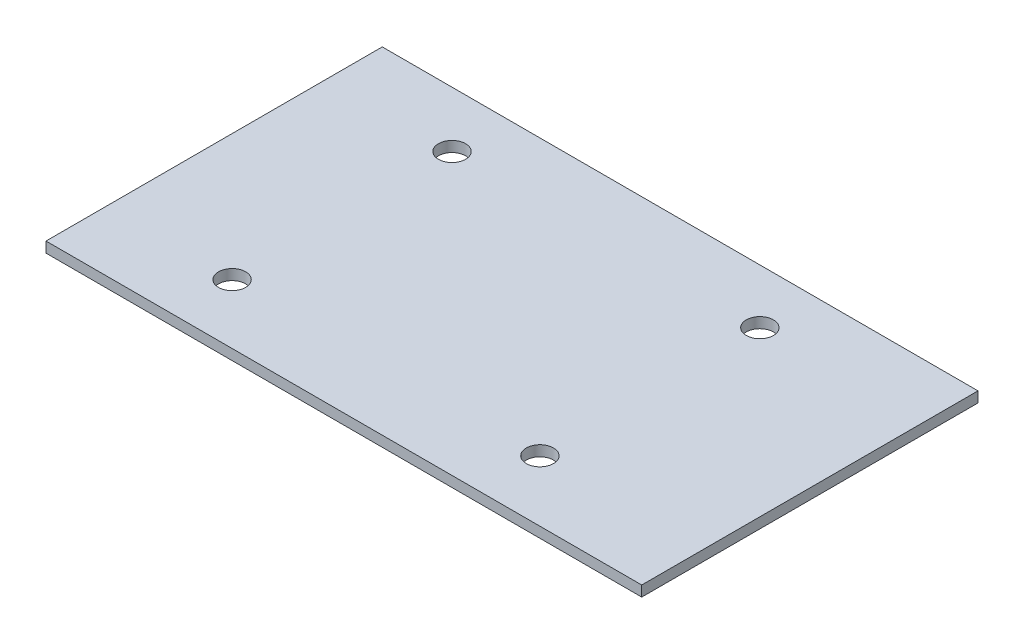
ISO-10303-21;
HEADER;
FILE_DESCRIPTION(('STEP AP214'),'2;1');
FILE_NAME('part.step','',(''),(''),'','','');
FILE_SCHEMA(('AUTOMOTIVE_DESIGN { 1 0 10303 214 1 1 1 1 }'));
ENDSEC;
DATA;
#1=APPLICATION_CONTEXT('core data for automotive mechanical design processes');
#2=APPLICATION_PROTOCOL_DEFINITION('international standard','automotive_design',2000,#1);
#3=PRODUCT_CONTEXT('',#1,'mechanical');
#4=PRODUCT('Part','Part','',(#3));
#5=PRODUCT_RELATED_PRODUCT_CATEGORY('part','',(#4));
#6=PRODUCT_DEFINITION_FORMATION('','',#4);
#7=PRODUCT_DEFINITION_CONTEXT('part definition',#1,'design');
#8=PRODUCT_DEFINITION('design','',#6,#7);
#9=PRODUCT_DEFINITION_SHAPE('','',#8);
#10=(LENGTH_UNIT() NAMED_UNIT(*) SI_UNIT(.MILLI.,.METRE.));
#11=(NAMED_UNIT(*) PLANE_ANGLE_UNIT() SI_UNIT($,.RADIAN.));
#12=(NAMED_UNIT(*) SI_UNIT($,.STERADIAN.) SOLID_ANGLE_UNIT());
#13=UNCERTAINTY_MEASURE_WITH_UNIT(LENGTH_MEASURE(1.E-05),#10,'distance_accuracy_value','');
#14=(GEOMETRIC_REPRESENTATION_CONTEXT(3) GLOBAL_UNCERTAINTY_ASSIGNED_CONTEXT((#13)) GLOBAL_UNIT_ASSIGNED_CONTEXT((#10,
#11,#12)) REPRESENTATION_CONTEXT('',''));
#15=CARTESIAN_POINT('',(0.,0.,0.));
#16=DIRECTION('',(0.,0.,1.));
#17=DIRECTION('',(1.,0.,0.));
#18=AXIS2_PLACEMENT_3D('',#15,#16,#17);
#19=CARTESIAN_POINT('',(0.,3.175,0.));
#20=DIRECTION('',(0.,-1.,0.));
#21=DIRECTION('',(0.,0.,-1.));
#22=AXIS2_PLACEMENT_3D('',#19,#20,#21);
#23=PLANE('',#22);
#24=DIRECTION('',(0.,0.,1.));
#25=VECTOR('',#24,1.);
#26=CARTESIAN_POINT('',(-90.,3.175,-50.8));
#27=LINE('',#26,#25);
#28=CARTESIAN_POINT('',(-90.,3.175,-50.8));
#29=VERTEX_POINT('',#28);
#30=CARTESIAN_POINT('',(-90.,3.175,50.8));
#31=VERTEX_POINT('',#30);
#32=EDGE_CURVE('E98',#29,#31,#27,.T.);
#33=ORIENTED_EDGE('',*,*,#32,.T.);
#34=DIRECTION('',(1.,0.,0.));
#35=VECTOR('',#34,1.);
#36=CARTESIAN_POINT('',(90.,3.175,50.8));
#37=LINE('',#36,#35);
#38=CARTESIAN_POINT('',(90.,3.175,50.8));
#39=VERTEX_POINT('',#38);
#40=EDGE_CURVE('E93',#31,#39,#37,.T.);
#41=ORIENTED_EDGE('',*,*,#40,.T.);
#42=DIRECTION('',(0.,0.,-1.));
#43=VECTOR('',#42,1.);
#44=CARTESIAN_POINT('',(90.,3.175,-50.8));
#45=LINE('',#44,#43);
#46=CARTESIAN_POINT('',(90.,3.175,-50.8));
#47=VERTEX_POINT('',#46);
#48=EDGE_CURVE('E96',#39,#47,#45,.T.);
#49=ORIENTED_EDGE('',*,*,#48,.T.);
#50=DIRECTION('',(-1.,0.,0.));
#51=VECTOR('',#50,1.);
#52=CARTESIAN_POINT('',(90.,3.175,-50.8));
#53=LINE('',#52,#51);
#54=EDGE_CURVE('E63',#47,#29,#53,.T.);
#55=ORIENTED_EDGE('',*,*,#54,.T.);
#56=EDGE_LOOP('',(#33,#41,#49,#55));
#57=FACE_BOUND('',#56,.T.);
#58=CARTESIAN_POINT('',(-52.086616080626,3.175,-33.968888188121));
#59=DIRECTION('',(0.,1.,0.));
#60=DIRECTION('',(0.,0.,1.));
#61=AXIS2_PLACEMENT_3D('',#58,#59,#60);
#62=CIRCLE('',#61,4.1);
#63=CARTESIAN_POINT('',(-52.086616080626,3.175,-29.868888188121));
#64=VERTEX_POINT('',#63);
#65=EDGE_CURVE('E118',#64,#64,#62,.T.);
#66=ORIENTED_EDGE('',*,*,#65,.F.);
#67=EDGE_LOOP('',(#66));
#68=FACE_BOUND('',#67,.T.);
#69=CARTESIAN_POINT('',(40.5125,3.175,-34.3734880976098));
#70=DIRECTION('',(0.,1.,0.));
#71=DIRECTION('',(0.,0.,1.));
#72=AXIS2_PLACEMENT_3D('',#69,#70,#71);
#73=CIRCLE('',#72,4.1);
#74=CARTESIAN_POINT('',(40.5125,3.175,-30.2734880976098));
#75=VERTEX_POINT('',#74);
#76=EDGE_CURVE('E140',#75,#75,#73,.T.);
#77=ORIENTED_EDGE('',*,*,#76,.F.);
#78=EDGE_LOOP('',(#77));
#79=FACE_BOUND('',#78,.T.);
#80=CARTESIAN_POINT('',(40.8041395305317,3.175,32.3728509599703));
#81=DIRECTION('',(0.,1.,0.));
#82=DIRECTION('',(0.,0.,1.));
#83=AXIS2_PLACEMENT_3D('',#80,#81,#82);
#84=CIRCLE('',#83,4.1);
#85=CARTESIAN_POINT('',(40.8041395305317,3.175,36.4728509599703));
#86=VERTEX_POINT('',#85);
#87=EDGE_CURVE('E148',#86,#86,#84,.T.);
#88=ORIENTED_EDGE('',*,*,#87,.F.);
#89=EDGE_LOOP('',(#88));
#90=FACE_BOUND('',#89,.T.);
#91=CARTESIAN_POINT('',(-51.7949765500943,3.175,32.7774508694591));
#92=DIRECTION('',(0.,1.,0.));
#93=DIRECTION('',(0.,0.,1.));
#94=AXIS2_PLACEMENT_3D('',#91,#92,#93);
#95=CIRCLE('',#94,4.1);
#96=CARTESIAN_POINT('',(-51.7949765500943,3.175,36.8774508694591));
#97=VERTEX_POINT('',#96);
#98=EDGE_CURVE('E156',#97,#97,#95,.T.);
#99=ORIENTED_EDGE('',*,*,#98,.F.);
#100=EDGE_LOOP('',(#99));
#101=FACE_BOUND('',#100,.T.);
#102=ADVANCED_FACE('F45',(#57,#68,#79,#90,#101),#23,.F.);
#103=CARTESIAN_POINT('',(0.,0.,0.));
#104=DIRECTION('',(0.,-1.,0.));
#105=DIRECTION('',(0.,0.,-1.));
#106=AXIS2_PLACEMENT_3D('',#103,#104,#105);
#107=PLANE('',#106);
#108=CARTESIAN_POINT('',(40.8041395305317,0.,32.3728509599703));
#109=DIRECTION('',(0.,1.,0.));
#110=DIRECTION('',(0.,0.,1.));
#111=AXIS2_PLACEMENT_3D('',#108,#109,#110);
#112=CIRCLE('',#111,4.1);
#113=CARTESIAN_POINT('',(40.8041395305317,0.,36.4728509599703));
#114=VERTEX_POINT('',#113);
#115=EDGE_CURVE('E152',#114,#114,#112,.T.);
#116=ORIENTED_EDGE('',*,*,#115,.T.);
#117=EDGE_LOOP('',(#116));
#118=FACE_BOUND('',#117,.T.);
#119=CARTESIAN_POINT('',(-52.086616080626,0.,-33.968888188121));
#120=DIRECTION('',(0.,1.,0.));
#121=DIRECTION('',(0.,0.,1.));
#122=AXIS2_PLACEMENT_3D('',#119,#120,#121);
#123=CIRCLE('',#122,4.1);
#124=CARTESIAN_POINT('',(-52.086616080626,0.,-29.868888188121));
#125=VERTEX_POINT('',#124);
#126=EDGE_CURVE('E136',#125,#125,#123,.T.);
#127=ORIENTED_EDGE('',*,*,#126,.T.);
#128=EDGE_LOOP('',(#127));
#129=FACE_BOUND('',#128,.T.);
#130=DIRECTION('',(0.,0.,1.));
#131=VECTOR('',#130,1.);
#132=CARTESIAN_POINT('',(-90.,0.,-50.8));
#133=LINE('',#132,#131);
#134=CARTESIAN_POINT('',(-90.,0.,-50.8));
#135=VERTEX_POINT('',#134);
#136=CARTESIAN_POINT('',(-90.,0.,50.8));
#137=VERTEX_POINT('',#136);
#138=EDGE_CURVE('E114',#135,#137,#133,.T.);
#139=ORIENTED_EDGE('',*,*,#138,.F.);
#140=DIRECTION('',(-1.,0.,0.));
#141=VECTOR('',#140,1.);
#142=CARTESIAN_POINT('',(90.,0.,-50.8));
#143=LINE('',#142,#141);
#144=CARTESIAN_POINT('',(90.,0.,-50.8));
#145=VERTEX_POINT('',#144);
#146=EDGE_CURVE('E86',#145,#135,#143,.T.);
#147=ORIENTED_EDGE('',*,*,#146,.F.);
#148=DIRECTION('',(0.,0.,-1.));
#149=VECTOR('',#148,1.);
#150=CARTESIAN_POINT('',(90.,0.,-50.8));
#151=LINE('',#150,#149);
#152=CARTESIAN_POINT('',(90.,0.,50.8));
#153=VERTEX_POINT('',#152);
#154=EDGE_CURVE('E80',#153,#145,#151,.T.);
#155=ORIENTED_EDGE('',*,*,#154,.F.);
#156=DIRECTION('',(1.,0.,0.));
#157=VECTOR('',#156,1.);
#158=CARTESIAN_POINT('',(90.,0.,50.8));
#159=LINE('',#158,#157);
#160=EDGE_CURVE('E103',#137,#153,#159,.T.);
#161=ORIENTED_EDGE('',*,*,#160,.F.);
#162=EDGE_LOOP('',(#139,#147,#155,#161));
#163=FACE_BOUND('',#162,.T.);
#164=CARTESIAN_POINT('',(40.5125,0.,-34.3734880976098));
#165=DIRECTION('',(0.,1.,0.));
#166=DIRECTION('',(0.,0.,1.));
#167=AXIS2_PLACEMENT_3D('',#164,#165,#166);
#168=CIRCLE('',#167,4.1);
#169=CARTESIAN_POINT('',(40.5125,0.,-30.2734880976098));
#170=VERTEX_POINT('',#169);
#171=EDGE_CURVE('E144',#170,#170,#168,.T.);
#172=ORIENTED_EDGE('',*,*,#171,.T.);
#173=EDGE_LOOP('',(#172));
#174=FACE_BOUND('',#173,.T.);
#175=CARTESIAN_POINT('',(-51.7949765500943,0.,32.7774508694591));
#176=DIRECTION('',(0.,1.,0.));
#177=DIRECTION('',(0.,0.,1.));
#178=AXIS2_PLACEMENT_3D('',#175,#176,#177);
#179=CIRCLE('',#178,4.1);
#180=CARTESIAN_POINT('',(-51.7949765500943,0.,36.8774508694591));
#181=VERTEX_POINT('',#180);
#182=EDGE_CURVE('E160',#181,#181,#179,.T.);
#183=ORIENTED_EDGE('',*,*,#182,.T.);
#184=EDGE_LOOP('',(#183));
#185=FACE_BOUND('',#184,.T.);
#186=ADVANCED_FACE('F131',(#118,#129,#163,#174,#185),#107,.T.);
#187=CARTESIAN_POINT('',(-90.,3.175,-50.8));
#188=DIRECTION('',(1.,0.,0.));
#189=DIRECTION('',(0.,0.,-1.));
#190=AXIS2_PLACEMENT_3D('',#187,#188,#189);
#191=PLANE('',#190);
#192=ORIENTED_EDGE('',*,*,#138,.T.);
#193=DIRECTION('',(0.,-1.,0.));
#194=VECTOR('',#193,1.);
#195=CARTESIAN_POINT('',(-90.,3.175,50.8));
#196=LINE('',#195,#194);
#197=EDGE_CURVE('E11',#31,#137,#196,.T.);
#198=ORIENTED_EDGE('',*,*,#197,.F.);
#199=ORIENTED_EDGE('',*,*,#32,.F.);
#200=DIRECTION('',(0.,-1.,0.));
#201=VECTOR('',#200,1.);
#202=CARTESIAN_POINT('',(-90.,3.175,-50.8));
#203=LINE('',#202,#201);
#204=EDGE_CURVE('E110',#29,#135,#203,.T.);
#205=ORIENTED_EDGE('',*,*,#204,.T.);
#206=EDGE_LOOP('',(#192,#198,#199,#205));
#207=FACE_BOUND('',#206,.T.);
#208=ADVANCED_FACE('F47',(#207),#191,.F.);
#209=CARTESIAN_POINT('',(90.,3.175,50.8));
#210=DIRECTION('',(0.,0.,-1.));
#211=DIRECTION('',(-1.,0.,0.));
#212=AXIS2_PLACEMENT_3D('',#209,#210,#211);
#213=PLANE('',#212);
#214=ORIENTED_EDGE('',*,*,#160,.T.);
#215=DIRECTION('',(0.,-1.,0.));
#216=VECTOR('',#215,1.);
#217=CARTESIAN_POINT('',(90.,3.175,50.8));
#218=LINE('',#217,#216);
#219=EDGE_CURVE('E55',#39,#153,#218,.T.);
#220=ORIENTED_EDGE('',*,*,#219,.F.);
#221=ORIENTED_EDGE('',*,*,#40,.F.);
#222=ORIENTED_EDGE('',*,*,#197,.T.);
#223=EDGE_LOOP('',(#214,#220,#221,#222));
#224=FACE_BOUND('',#223,.T.);
#225=ADVANCED_FACE('F102',(#224),#213,.F.);
#226=CARTESIAN_POINT('',(90.,3.175,-50.8));
#227=DIRECTION('',(-1.,0.,0.));
#228=DIRECTION('',(0.,0.,1.));
#229=AXIS2_PLACEMENT_3D('',#226,#227,#228);
#230=PLANE('',#229);
#231=ORIENTED_EDGE('',*,*,#154,.T.);
#232=DIRECTION('',(0.,-1.,0.));
#233=VECTOR('',#232,1.);
#234=CARTESIAN_POINT('',(90.,3.175,-50.8));
#235=LINE('',#234,#233);
#236=EDGE_CURVE('E105',#47,#145,#235,.T.);
#237=ORIENTED_EDGE('',*,*,#236,.F.);
#238=ORIENTED_EDGE('',*,*,#48,.F.);
#239=ORIENTED_EDGE('',*,*,#219,.T.);
#240=EDGE_LOOP('',(#231,#237,#238,#239));
#241=FACE_BOUND('',#240,.T.);
#242=ADVANCED_FACE('F106',(#241),#230,.F.);
#243=CARTESIAN_POINT('',(90.,3.175,-50.8));
#244=DIRECTION('',(0.,0.,1.));
#245=DIRECTION('',(1.,0.,0.));
#246=AXIS2_PLACEMENT_3D('',#243,#244,#245);
#247=PLANE('',#246);
#248=ORIENTED_EDGE('',*,*,#146,.T.);
#249=ORIENTED_EDGE('',*,*,#204,.F.);
#250=ORIENTED_EDGE('',*,*,#54,.F.);
#251=ORIENTED_EDGE('',*,*,#236,.T.);
#252=EDGE_LOOP('',(#248,#249,#250,#251));
#253=FACE_BOUND('',#252,.T.);
#254=ADVANCED_FACE('F128',(#253),#247,.F.);
#255=CARTESIAN_POINT('',(-52.086616080626,3.175,-33.968888188121));
#256=DIRECTION('',(0.,-1.,0.));
#257=DIRECTION('',(0.,0.,-1.));
#258=AXIS2_PLACEMENT_3D('',#255,#256,#257);
#259=CYLINDRICAL_SURFACE('',#258,4.1);
#260=ORIENTED_EDGE('',*,*,#65,.T.);
#261=EDGE_LOOP('',(#260));
#262=FACE_BOUND('',#261,.T.);
#263=ORIENTED_EDGE('',*,*,#126,.F.);
#264=EDGE_LOOP('',(#263));
#265=FACE_BOUND('',#264,.T.);
#266=ADVANCED_FACE('F179',(#262,#265),#259,.F.);
#267=CARTESIAN_POINT('',(40.5125,3.175,-34.3734880976098));
#268=DIRECTION('',(0.,-1.,0.));
#269=DIRECTION('',(0.,0.,-1.));
#270=AXIS2_PLACEMENT_3D('',#267,#268,#269);
#271=CYLINDRICAL_SURFACE('',#270,4.1);
#272=ORIENTED_EDGE('',*,*,#76,.T.);
#273=EDGE_LOOP('',(#272));
#274=FACE_BOUND('',#273,.T.);
#275=ORIENTED_EDGE('',*,*,#171,.F.);
#276=EDGE_LOOP('',(#275));
#277=FACE_BOUND('',#276,.T.);
#278=ADVANCED_FACE('F224',(#274,#277),#271,.F.);
#279=CARTESIAN_POINT('',(40.8041395305317,3.175,32.3728509599703));
#280=DIRECTION('',(0.,-1.,0.));
#281=DIRECTION('',(0.,0.,-1.));
#282=AXIS2_PLACEMENT_3D('',#279,#280,#281);
#283=CYLINDRICAL_SURFACE('',#282,4.1);
#284=ORIENTED_EDGE('',*,*,#87,.T.);
#285=EDGE_LOOP('',(#284));
#286=FACE_BOUND('',#285,.T.);
#287=ORIENTED_EDGE('',*,*,#115,.F.);
#288=EDGE_LOOP('',(#287));
#289=FACE_BOUND('',#288,.T.);
#290=ADVANCED_FACE('F232',(#286,#289),#283,.F.);
#291=CARTESIAN_POINT('',(-51.7949765500943,3.175,32.7774508694591));
#292=DIRECTION('',(0.,-1.,0.));
#293=DIRECTION('',(0.,0.,-1.));
#294=AXIS2_PLACEMENT_3D('',#291,#292,#293);
#295=CYLINDRICAL_SURFACE('',#294,4.1);
#296=ORIENTED_EDGE('',*,*,#98,.T.);
#297=EDGE_LOOP('',(#296));
#298=FACE_BOUND('',#297,.T.);
#299=ORIENTED_EDGE('',*,*,#182,.F.);
#300=EDGE_LOOP('',(#299));
#301=FACE_BOUND('',#300,.T.);
#302=ADVANCED_FACE('F168',(#298,#301),#295,.F.);
#303=CLOSED_SHELL('',(#102,#186,#208,#225,#242,#254,#266,#278,#290,#302));
#304=MANIFOLD_SOLID_BREP('B2',#303);
#305=ADVANCED_BREP_SHAPE_REPRESENTATION('',(#18,#304),#14);
#306=SHAPE_DEFINITION_REPRESENTATION(#9,#305);
ENDSEC;
END-ISO-10303-21;
